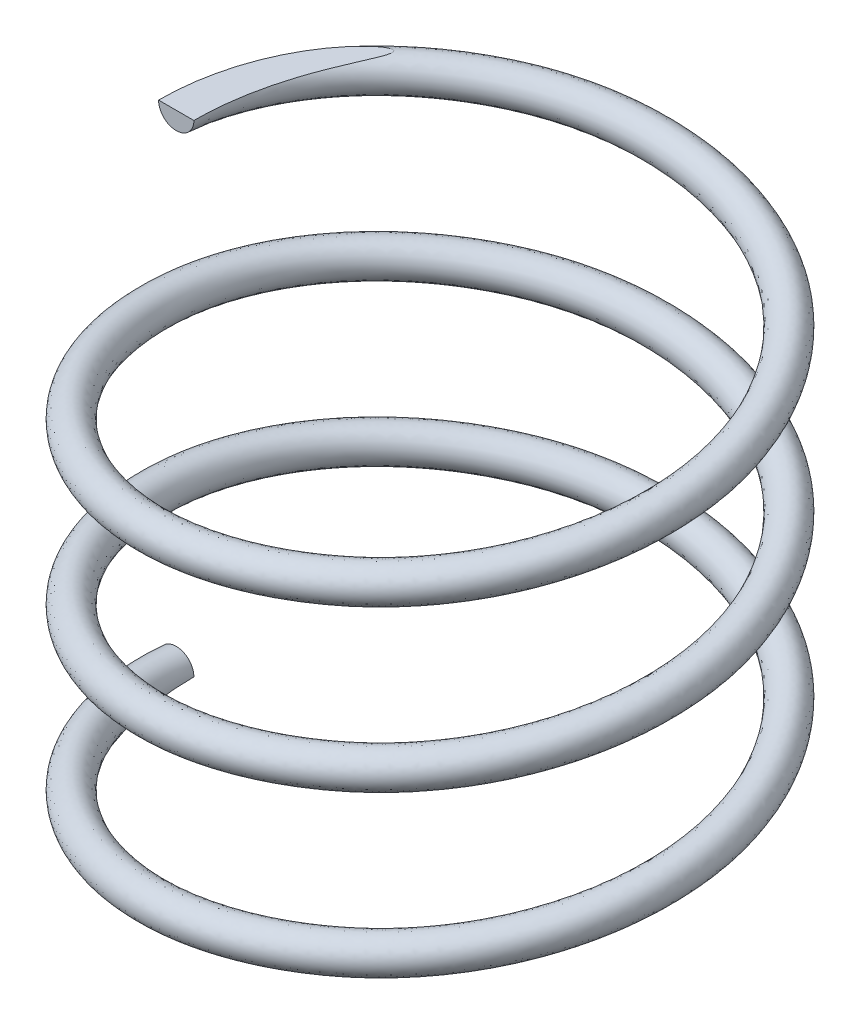
ISO-10303-21;
HEADER;
FILE_DESCRIPTION(('STEP AP214'),'2;1');
FILE_NAME('part.step','',(''),(''),'','','');
FILE_SCHEMA(('AUTOMOTIVE_DESIGN { 1 0 10303 214 1 1 1 1 }'));
ENDSEC;
DATA;
#1=APPLICATION_CONTEXT('core data for automotive mechanical design processes');
#2=APPLICATION_PROTOCOL_DEFINITION('international standard','automotive_design',2000,#1);
#3=PRODUCT_CONTEXT('',#1,'mechanical');
#4=PRODUCT('Part','Part','',(#3));
#5=PRODUCT_RELATED_PRODUCT_CATEGORY('part','',(#4));
#6=PRODUCT_DEFINITION_FORMATION('','',#4);
#7=PRODUCT_DEFINITION_CONTEXT('part definition',#1,'design');
#8=PRODUCT_DEFINITION('design','',#6,#7);
#9=PRODUCT_DEFINITION_SHAPE('','',#8);
#10=(LENGTH_UNIT() NAMED_UNIT(*) SI_UNIT(.MILLI.,.METRE.));
#11=(NAMED_UNIT(*) PLANE_ANGLE_UNIT() SI_UNIT($,.RADIAN.));
#12=(NAMED_UNIT(*) SI_UNIT($,.STERADIAN.) SOLID_ANGLE_UNIT());
#13=UNCERTAINTY_MEASURE_WITH_UNIT(LENGTH_MEASURE(1.E-05),#10,'distance_accuracy_value','');
#14=(GEOMETRIC_REPRESENTATION_CONTEXT(3) GLOBAL_UNCERTAINTY_ASSIGNED_CONTEXT((#13)) GLOBAL_UNIT_ASSIGNED_CONTEXT((#10,
#11,#12)) REPRESENTATION_CONTEXT('',''));
#15=CARTESIAN_POINT('',(0.,0.,0.));
#16=DIRECTION('',(0.,0.,1.));
#17=DIRECTION('',(1.,0.,0.));
#18=AXIS2_PLACEMENT_3D('',#15,#16,#17);
#19=CARTESIAN_POINT('',(-10.033,19.05,4.20360387271358E-13));
#20=DIRECTION('',(0.,0.,1.));
#21=DIRECTION('',(1.,0.,0.));
#22=AXIS2_PLACEMENT_3D('',#19,#20,#21);
#23=PLANE('',#22);
#24=CARTESIAN_POINT('',(-10.033,19.05,4.20360387271358E-13));
#25=DIRECTION('',(0.,0.,1.));
#26=DIRECTION('',(1.,0.,0.));
#27=AXIS2_PLACEMENT_3D('',#24,#25,#26);
#28=CIRCLE('',#27,0.698499999999999);
#29=CARTESIAN_POINT('',(-10.7315,19.05,0.));
#30=VERTEX_POINT('',#29);
#31=CARTESIAN_POINT('',(-9.3345,19.05,3.91094790689175E-13));
#32=VERTEX_POINT('',#31);
#33=EDGE_CURVE('E68',#30,#32,#28,.T.);
#34=ORIENTED_EDGE('',*,*,#33,.T.);
#35=DIRECTION('',(-1.,0.,0.));
#36=VECTOR('',#35,1.);
#37=CARTESIAN_POINT('',(-10.033,19.05,4.20360387271358E-13));
#38=LINE('',#37,#36);
#39=EDGE_CURVE('E54',#32,#30,#38,.T.);
#40=ORIENTED_EDGE('',*,*,#39,.T.);
#41=EDGE_LOOP('',(#34,#40));
#42=FACE_BOUND('',#41,.T.);
#43=ADVANCED_FACE('F34',(#42),#23,.T.);
#44=CARTESIAN_POINT('',(-9.3345,0.,0.));
#45=CARTESIAN_POINT('',(-9.3345,0.529166666666664,5.38927608775056));
#46=CARTESIAN_POINT('',(-4.66725,1.05833333333333,8.08391413162584));
#47=CARTESIAN_POINT('',(0.,1.58749999999999,10.7785521755011));
#48=CARTESIAN_POINT('',(4.66725,2.11666666666666,8.08391413162584));
#49=CARTESIAN_POINT('',(9.3345,2.64583333333333,5.38927608775056));
#50=CARTESIAN_POINT('',(9.3345,3.17499999999999,0.));
#51=CARTESIAN_POINT('',(9.3345,3.70416666666666,-5.38927608775056));
#52=CARTESIAN_POINT('',(4.66725,4.23333333333332,-8.08391413162584));
#53=CARTESIAN_POINT('',(0.,4.76249999999999,-10.7785521755011));
#54=CARTESIAN_POINT('',(-4.66724999999999,5.29166666666665,-8.08391413162584));
#55=CARTESIAN_POINT('',(-9.33449999999999,5.82083333333332,-5.38927608775057));
#56=CARTESIAN_POINT('',(-9.3345,6.34999999999998,0.));
#57=CARTESIAN_POINT('',(-9.3345,6.87916666666665,5.38927608775056));
#58=CARTESIAN_POINT('',(-4.66725,7.40833333333331,8.08391413162584));
#59=CARTESIAN_POINT('',(0.,7.93749999999998,10.7785521755011));
#60=CARTESIAN_POINT('',(4.66725,8.46666666666664,8.08391413162584));
#61=CARTESIAN_POINT('',(9.3345,8.99583333333331,5.38927608775056));
#62=CARTESIAN_POINT('',(9.3345,9.52499999999997,0.));
#63=CARTESIAN_POINT('',(9.3345,10.0541666666666,-5.38927608775056));
#64=CARTESIAN_POINT('',(4.66725,10.5833333333333,-8.08391413162584));
#65=CARTESIAN_POINT('',(0.,11.1125,-10.7785521755011));
#66=CARTESIAN_POINT('',(-4.66724999999999,11.6416666666666,-8.08391413162584));
#67=CARTESIAN_POINT('',(-9.33449999999999,12.1708333333333,-5.38927608775057));
#68=CARTESIAN_POINT('',(-9.3345,12.7,0.));
#69=CARTESIAN_POINT('',(-9.3345,13.2291666666666,5.38927608775056));
#70=CARTESIAN_POINT('',(-4.66725,13.7583333333333,8.08391413162584));
#71=CARTESIAN_POINT('',(0.,14.2875,10.7785521755011));
#72=CARTESIAN_POINT('',(4.66725,14.8166666666666,8.08391413162584));
#73=CARTESIAN_POINT('',(9.3345,15.3458333333333,5.38927608775056));
#74=CARTESIAN_POINT('',(9.3345,15.875,0.));
#75=CARTESIAN_POINT('',(9.3345,16.4041666666666,-5.38927608775056));
#76=CARTESIAN_POINT('',(4.66725,16.9333333333333,-8.08391413162584));
#77=CARTESIAN_POINT('',(0.,17.4625,-10.7785521755011));
#78=CARTESIAN_POINT('',(-4.66724999999999,17.9916666666666,-8.08391413162584));
#79=CARTESIAN_POINT('',(-9.33449999999999,18.5208333333333,-5.38927608775057));
#80=CARTESIAN_POINT('',(-9.3345,19.05,0.));
#81=CARTESIAN_POINT('',(-9.3345,1.397,0.));
#82=CARTESIAN_POINT('',(-9.3345,1.92616666666666,5.38927608775056));
#83=CARTESIAN_POINT('',(-4.66725,2.45533333333333,8.08391413162584));
#84=CARTESIAN_POINT('',(0.,2.98449999999999,10.7785521755011));
#85=CARTESIAN_POINT('',(4.66725,3.51366666666666,8.08391413162584));
#86=CARTESIAN_POINT('',(9.3345,4.04283333333332,5.38927608775056));
#87=CARTESIAN_POINT('',(9.3345,4.57199999999999,0.));
#88=CARTESIAN_POINT('',(9.3345,5.10116666666665,-5.38927608775056));
#89=CARTESIAN_POINT('',(4.66725,5.63033333333332,-8.08391413162584));
#90=CARTESIAN_POINT('',(0.,6.15949999999999,-10.7785521755011));
#91=CARTESIAN_POINT('',(-4.66724999999999,6.68866666666665,-8.08391413162584));
#92=CARTESIAN_POINT('',(-9.3345,7.21783333333332,-5.38927608775057));
#93=CARTESIAN_POINT('',(-9.3345,7.74699999999998,0.));
#94=CARTESIAN_POINT('',(-9.3345,8.27616666666665,5.38927608775056));
#95=CARTESIAN_POINT('',(-4.66725,8.80533333333331,8.08391413162584));
#96=CARTESIAN_POINT('',(0.,9.33449999999998,10.7785521755011));
#97=CARTESIAN_POINT('',(4.66725,9.86366666666664,8.08391413162584));
#98=CARTESIAN_POINT('',(9.3345,10.3928333333333,5.38927608775056));
#99=CARTESIAN_POINT('',(9.3345,10.922,0.));
#100=CARTESIAN_POINT('',(9.3345,11.4511666666666,-5.38927608775056));
#101=CARTESIAN_POINT('',(4.66725,11.9803333333333,-8.08391413162584));
#102=CARTESIAN_POINT('',(0.,12.5095,-10.7785521755011));
#103=CARTESIAN_POINT('',(-4.66724999999999,13.0386666666666,-8.08391413162584));
#104=CARTESIAN_POINT('',(-9.3345,13.5678333333333,-5.38927608775057));
#105=CARTESIAN_POINT('',(-9.3345,14.097,0.));
#106=CARTESIAN_POINT('',(-9.3345,14.6261666666666,5.38927608775056));
#107=CARTESIAN_POINT('',(-4.66725,15.1553333333333,8.08391413162584));
#108=CARTESIAN_POINT('',(0.,15.6845,10.7785521755011));
#109=CARTESIAN_POINT('',(4.66725,16.2136666666666,8.08391413162584));
#110=CARTESIAN_POINT('',(9.3345,16.7428333333333,5.38927608775056));
#111=CARTESIAN_POINT('',(9.3345,17.272,0.));
#112=CARTESIAN_POINT('',(9.3345,17.8011666666666,-5.38927608775056));
#113=CARTESIAN_POINT('',(4.66725,18.3303333333333,-8.08391413162584));
#114=CARTESIAN_POINT('',(0.,18.8595,-10.7785521755011));
#115=CARTESIAN_POINT('',(-4.66724999999999,19.3886666666666,-8.08391413162584));
#116=CARTESIAN_POINT('',(-9.3345,19.9178333333333,-5.38927608775057));
#117=CARTESIAN_POINT('',(-9.3345,20.4469999999999,0.));
#118=CARTESIAN_POINT('',(-10.7315,1.397,0.));
#119=CARTESIAN_POINT('',(-10.7315,1.92616666666666,6.19583441380847));
#120=CARTESIAN_POINT('',(-5.36575,2.45533333333333,9.2937516207127));
#121=CARTESIAN_POINT('',(0.,2.98449999999999,12.3916688276169));
#122=CARTESIAN_POINT('',(5.36575,3.51366666666666,9.2937516207127));
#123=CARTESIAN_POINT('',(10.7315,4.04283333333332,6.19583441380847));
#124=CARTESIAN_POINT('',(10.7315,4.57199999999999,0.));
#125=CARTESIAN_POINT('',(10.7315,5.10116666666665,-6.19583441380846));
#126=CARTESIAN_POINT('',(5.36575,5.63033333333332,-9.2937516207127));
#127=CARTESIAN_POINT('',(0.,6.15949999999999,-12.3916688276169));
#128=CARTESIAN_POINT('',(-5.36574999999999,6.68866666666665,-9.29375162071271));
#129=CARTESIAN_POINT('',(-10.7315,7.21783333333332,-6.19583441380847));
#130=CARTESIAN_POINT('',(-10.7315,7.74699999999998,0.));
#131=CARTESIAN_POINT('',(-10.7315,8.27616666666665,6.19583441380847));
#132=CARTESIAN_POINT('',(-5.36575,8.80533333333331,9.2937516207127));
#133=CARTESIAN_POINT('',(0.,9.33449999999998,12.3916688276169));
#134=CARTESIAN_POINT('',(5.36575,9.86366666666664,9.2937516207127));
#135=CARTESIAN_POINT('',(10.7315,10.3928333333333,6.19583441380847));
#136=CARTESIAN_POINT('',(10.7315,10.922,0.));
#137=CARTESIAN_POINT('',(10.7315,11.4511666666666,-6.19583441380846));
#138=CARTESIAN_POINT('',(5.36575,11.9803333333333,-9.2937516207127));
#139=CARTESIAN_POINT('',(0.,12.5095,-12.3916688276169));
#140=CARTESIAN_POINT('',(-5.36574999999999,13.0386666666666,-9.29375162071271));
#141=CARTESIAN_POINT('',(-10.7315,13.5678333333333,-6.19583441380847));
#142=CARTESIAN_POINT('',(-10.7315,14.097,0.));
#143=CARTESIAN_POINT('',(-10.7315,14.6261666666666,6.19583441380847));
#144=CARTESIAN_POINT('',(-5.36575,15.1553333333333,9.2937516207127));
#145=CARTESIAN_POINT('',(0.,15.6845,12.3916688276169));
#146=CARTESIAN_POINT('',(5.36575,16.2136666666666,9.2937516207127));
#147=CARTESIAN_POINT('',(10.7315,16.7428333333333,6.19583441380847));
#148=CARTESIAN_POINT('',(10.7315,17.272,0.));
#149=CARTESIAN_POINT('',(10.7315,17.8011666666666,-6.19583441380846));
#150=CARTESIAN_POINT('',(5.36575,18.3303333333333,-9.2937516207127));
#151=CARTESIAN_POINT('',(0.,18.8595,-12.3916688276169));
#152=CARTESIAN_POINT('',(-5.36574999999999,19.3886666666666,-9.29375162071271));
#153=CARTESIAN_POINT('',(-10.7315,19.9178333333333,-6.19583441380847));
#154=CARTESIAN_POINT('',(-10.7315,20.4469999999999,0.));
#155=CARTESIAN_POINT('',(-10.7315,0.,0.));
#156=CARTESIAN_POINT('',(-10.7315,0.529166666666664,6.19583441380847));
#157=CARTESIAN_POINT('',(-5.36575,1.05833333333333,9.2937516207127));
#158=CARTESIAN_POINT('',(0.,1.5875,12.3916688276169));
#159=CARTESIAN_POINT('',(5.36575,2.11666666666666,9.2937516207127));
#160=CARTESIAN_POINT('',(10.7315,2.64583333333333,6.19583441380847));
#161=CARTESIAN_POINT('',(10.7315,3.17499999999999,0.));
#162=CARTESIAN_POINT('',(10.7315,3.70416666666666,-6.19583441380846));
#163=CARTESIAN_POINT('',(5.36575,4.23333333333332,-9.2937516207127));
#164=CARTESIAN_POINT('',(0.,4.76249999999999,-12.3916688276169));
#165=CARTESIAN_POINT('',(-5.36574999999999,5.29166666666665,-9.29375162071271));
#166=CARTESIAN_POINT('',(-10.7315,5.82083333333332,-6.19583441380847));
#167=CARTESIAN_POINT('',(-10.7315,6.34999999999998,0.));
#168=CARTESIAN_POINT('',(-10.7315,6.87916666666665,6.19583441380847));
#169=CARTESIAN_POINT('',(-5.36575,7.40833333333331,9.2937516207127));
#170=CARTESIAN_POINT('',(0.,7.93749999999998,12.3916688276169));
#171=CARTESIAN_POINT('',(5.36575,8.46666666666664,9.2937516207127));
#172=CARTESIAN_POINT('',(10.7315,8.99583333333331,6.19583441380847));
#173=CARTESIAN_POINT('',(10.7315,9.52499999999997,0.));
#174=CARTESIAN_POINT('',(10.7315,10.0541666666666,-6.19583441380846));
#175=CARTESIAN_POINT('',(5.36575,10.5833333333333,-9.2937516207127));
#176=CARTESIAN_POINT('',(0.,11.1125,-12.3916688276169));
#177=CARTESIAN_POINT('',(-5.36574999999999,11.6416666666666,-9.29375162071271));
#178=CARTESIAN_POINT('',(-10.7315,12.1708333333333,-6.19583441380847));
#179=CARTESIAN_POINT('',(-10.7315,12.7,0.));
#180=CARTESIAN_POINT('',(-10.7315,13.2291666666666,6.19583441380847));
#181=CARTESIAN_POINT('',(-5.36575,13.7583333333333,9.2937516207127));
#182=CARTESIAN_POINT('',(0.,14.2875,12.3916688276169));
#183=CARTESIAN_POINT('',(5.36575,14.8166666666666,9.2937516207127));
#184=CARTESIAN_POINT('',(10.7315,15.3458333333333,6.19583441380847));
#185=CARTESIAN_POINT('',(10.7315,15.875,0.));
#186=CARTESIAN_POINT('',(10.7315,16.4041666666666,-6.19583441380846));
#187=CARTESIAN_POINT('',(5.36575,16.9333333333333,-9.2937516207127));
#188=CARTESIAN_POINT('',(0.,17.4625,-12.3916688276169));
#189=CARTESIAN_POINT('',(-5.36574999999999,17.9916666666666,-9.29375162071271));
#190=CARTESIAN_POINT('',(-10.7315,18.5208333333333,-6.19583441380847));
#191=CARTESIAN_POINT('',(-10.7315,19.05,0.));
#192=CARTESIAN_POINT('',(-10.7315,-1.397,0.));
#193=CARTESIAN_POINT('',(-10.7315,-0.867833333333334,6.19583441380847));
#194=CARTESIAN_POINT('',(-5.36575,-0.338666666666669,9.2937516207127));
#195=CARTESIAN_POINT('',(0.,0.190499999999997,12.3916688276169));
#196=CARTESIAN_POINT('',(5.36575,0.719666666666662,9.2937516207127));
#197=CARTESIAN_POINT('',(10.7315,1.24883333333333,6.19583441380847));
#198=CARTESIAN_POINT('',(10.7315,1.77799999999999,0.));
#199=CARTESIAN_POINT('',(10.7315,2.30716666666666,-6.19583441380846));
#200=CARTESIAN_POINT('',(5.36575,2.83633333333332,-9.2937516207127));
#201=CARTESIAN_POINT('',(0.,3.36549999999999,-12.3916688276169));
#202=CARTESIAN_POINT('',(-5.36574999999999,3.89466666666665,-9.29375162071271));
#203=CARTESIAN_POINT('',(-10.7315,4.42383333333332,-6.19583441380847));
#204=CARTESIAN_POINT('',(-10.7315,4.95299999999999,0.));
#205=CARTESIAN_POINT('',(-10.7315,5.48216666666665,6.19583441380847));
#206=CARTESIAN_POINT('',(-5.36575,6.01133333333332,9.2937516207127));
#207=CARTESIAN_POINT('',(0.,6.54049999999998,12.3916688276169));
#208=CARTESIAN_POINT('',(5.36575,7.06966666666665,9.2937516207127));
#209=CARTESIAN_POINT('',(10.7315,7.59883333333331,6.19583441380847));
#210=CARTESIAN_POINT('',(10.7315,8.12799999999998,0.));
#211=CARTESIAN_POINT('',(10.7315,8.65716666666664,-6.19583441380846));
#212=CARTESIAN_POINT('',(5.36575,9.18633333333331,-9.2937516207127));
#213=CARTESIAN_POINT('',(0.,9.71549999999997,-12.3916688276169));
#214=CARTESIAN_POINT('',(-5.36574999999999,10.2446666666666,-9.29375162071271));
#215=CARTESIAN_POINT('',(-10.7315,10.7738333333333,-6.19583441380847));
#216=CARTESIAN_POINT('',(-10.7315,11.303,0.));
#217=CARTESIAN_POINT('',(-10.7315,11.8321666666666,6.19583441380847));
#218=CARTESIAN_POINT('',(-5.36575,12.3613333333333,9.2937516207127));
#219=CARTESIAN_POINT('',(0.,12.8905,12.3916688276169));
#220=CARTESIAN_POINT('',(5.36575,13.4196666666666,9.2937516207127));
#221=CARTESIAN_POINT('',(10.7315,13.9488333333333,6.19583441380847));
#222=CARTESIAN_POINT('',(10.7315,14.478,0.));
#223=CARTESIAN_POINT('',(10.7315,15.0071666666666,-6.19583441380846));
#224=CARTESIAN_POINT('',(5.36575,15.5363333333333,-9.2937516207127));
#225=CARTESIAN_POINT('',(0.,16.0655,-12.3916688276169));
#226=CARTESIAN_POINT('',(-5.36574999999999,16.5946666666666,-9.29375162071271));
#227=CARTESIAN_POINT('',(-10.7315,17.1238333333333,-6.19583441380847));
#228=CARTESIAN_POINT('',(-10.7315,17.653,0.));
#229=CARTESIAN_POINT('',(-9.3345,-1.397,0.));
#230=CARTESIAN_POINT('',(-9.3345,-0.867833333333334,5.38927608775056));
#231=CARTESIAN_POINT('',(-4.66725,-0.338666666666669,8.08391413162584));
#232=CARTESIAN_POINT('',(0.,0.190499999999997,10.7785521755011));
#233=CARTESIAN_POINT('',(4.66725,0.719666666666662,8.08391413162584));
#234=CARTESIAN_POINT('',(9.3345,1.24883333333333,5.38927608775056));
#235=CARTESIAN_POINT('',(9.3345,1.77799999999999,0.));
#236=CARTESIAN_POINT('',(9.3345,2.30716666666666,-5.38927608775056));
#237=CARTESIAN_POINT('',(4.66725,2.83633333333332,-8.08391413162584));
#238=CARTESIAN_POINT('',(0.,3.36549999999999,-10.7785521755011));
#239=CARTESIAN_POINT('',(-4.66724999999999,3.89466666666665,-8.08391413162584));
#240=CARTESIAN_POINT('',(-9.3345,4.42383333333332,-5.38927608775057));
#241=CARTESIAN_POINT('',(-9.3345,4.95299999999999,0.));
#242=CARTESIAN_POINT('',(-9.3345,5.48216666666665,5.38927608775056));
#243=CARTESIAN_POINT('',(-4.66725,6.01133333333331,8.08391413162584));
#244=CARTESIAN_POINT('',(0.,6.54049999999998,10.7785521755011));
#245=CARTESIAN_POINT('',(4.66725,7.06966666666665,8.08391413162584));
#246=CARTESIAN_POINT('',(9.3345,7.59883333333331,5.38927608775056));
#247=CARTESIAN_POINT('',(9.3345,8.12799999999998,0.));
#248=CARTESIAN_POINT('',(9.3345,8.65716666666664,-5.38927608775056));
#249=CARTESIAN_POINT('',(4.66725,9.18633333333331,-8.08391413162584));
#250=CARTESIAN_POINT('',(0.,9.71549999999997,-10.7785521755011));
#251=CARTESIAN_POINT('',(-4.66724999999999,10.2446666666666,-8.08391413162584));
#252=CARTESIAN_POINT('',(-9.3345,10.7738333333333,-5.38927608775057));
#253=CARTESIAN_POINT('',(-9.3345,11.303,0.));
#254=CARTESIAN_POINT('',(-9.3345,11.8321666666666,5.38927608775056));
#255=CARTESIAN_POINT('',(-4.66725,12.3613333333333,8.08391413162584));
#256=CARTESIAN_POINT('',(0.,12.8905,10.7785521755011));
#257=CARTESIAN_POINT('',(4.66725,13.4196666666666,8.08391413162584));
#258=CARTESIAN_POINT('',(9.3345,13.9488333333333,5.38927608775056));
#259=CARTESIAN_POINT('',(9.3345,14.478,0.));
#260=CARTESIAN_POINT('',(9.3345,15.0071666666666,-5.38927608775056));
#261=CARTESIAN_POINT('',(4.66725,15.5363333333333,-8.08391413162584));
#262=CARTESIAN_POINT('',(0.,16.0655,-10.7785521755011));
#263=CARTESIAN_POINT('',(-4.66724999999999,16.5946666666666,-8.08391413162584));
#264=CARTESIAN_POINT('',(-9.3345,17.1238333333333,-5.38927608775057));
#265=CARTESIAN_POINT('',(-9.3345,17.653,0.));
#266=CARTESIAN_POINT('',(-9.3345,0.,0.));
#267=CARTESIAN_POINT('',(-9.3345,0.529166666666664,5.38927608775056));
#268=CARTESIAN_POINT('',(-4.66725,1.05833333333333,8.08391413162584));
#269=CARTESIAN_POINT('',(0.,1.58749999999999,10.7785521755011));
#270=CARTESIAN_POINT('',(4.66725,2.11666666666666,8.08391413162584));
#271=CARTESIAN_POINT('',(9.3345,2.64583333333333,5.38927608775056));
#272=CARTESIAN_POINT('',(9.3345,3.17499999999999,0.));
#273=CARTESIAN_POINT('',(9.3345,3.70416666666666,-5.38927608775056));
#274=CARTESIAN_POINT('',(4.66725,4.23333333333332,-8.08391413162584));
#275=CARTESIAN_POINT('',(0.,4.76249999999999,-10.7785521755011));
#276=CARTESIAN_POINT('',(-4.66724999999999,5.29166666666665,-8.08391413162584));
#277=CARTESIAN_POINT('',(-9.33449999999999,5.82083333333332,-5.38927608775057));
#278=CARTESIAN_POINT('',(-9.3345,6.34999999999998,0.));
#279=CARTESIAN_POINT('',(-9.3345,6.87916666666665,5.38927608775056));
#280=CARTESIAN_POINT('',(-4.66725,7.40833333333331,8.08391413162584));
#281=CARTESIAN_POINT('',(0.,7.93749999999998,10.7785521755011));
#282=CARTESIAN_POINT('',(4.66725,8.46666666666664,8.08391413162584));
#283=CARTESIAN_POINT('',(9.3345,8.99583333333331,5.38927608775056));
#284=CARTESIAN_POINT('',(9.3345,9.52499999999997,0.));
#285=CARTESIAN_POINT('',(9.3345,10.0541666666666,-5.38927608775056));
#286=CARTESIAN_POINT('',(4.66725,10.5833333333333,-8.08391413162584));
#287=CARTESIAN_POINT('',(0.,11.1125,-10.7785521755011));
#288=CARTESIAN_POINT('',(-4.66724999999999,11.6416666666666,-8.08391413162584));
#289=CARTESIAN_POINT('',(-9.33449999999999,12.1708333333333,-5.38927608775057));
#290=CARTESIAN_POINT('',(-9.3345,12.7,0.));
#291=CARTESIAN_POINT('',(-9.3345,13.2291666666666,5.38927608775056));
#292=CARTESIAN_POINT('',(-4.66725,13.7583333333333,8.08391413162584));
#293=CARTESIAN_POINT('',(0.,14.2875,10.7785521755011));
#294=CARTESIAN_POINT('',(4.66725,14.8166666666666,8.08391413162584));
#295=CARTESIAN_POINT('',(9.3345,15.3458333333333,5.38927608775056));
#296=CARTESIAN_POINT('',(9.3345,15.875,0.));
#297=CARTESIAN_POINT('',(9.3345,16.4041666666666,-5.38927608775056));
#298=CARTESIAN_POINT('',(4.66725,16.9333333333333,-8.08391413162584));
#299=CARTESIAN_POINT('',(0.,17.4625,-10.7785521755011));
#300=CARTESIAN_POINT('',(-4.66724999999999,17.9916666666666,-8.08391413162584));
#301=CARTESIAN_POINT('',(-9.33449999999999,18.5208333333333,-5.38927608775057));
#302=CARTESIAN_POINT('',(-9.3345,19.05,0.));
#303=(BOUNDED_SURFACE() B_SPLINE_SURFACE(3,2,((#44,#45,#46,#47,#48,#49,#50,#51,#52,#53,#54,#55,
#56,#57,#58,#59,#60,#61,#62,#63,#64,#65,#66,#67,#68,#69,#70,#71,#72,#73,#74,#75,#76,#77,#78,#79,
#80),(#81,#82,#83,#84,#85,#86,#87,#88,#89,#90,#91,#92,#93,#94,#95,#96,#97,#98,#99,#100,#101,
#102,#103,#104,#105,#106,#107,#108,#109,#110,#111,#112,#113,#114,#115,#116,#117),(#118,#119,
#120,#121,#122,#123,#124,#125,#126,#127,#128,#129,#130,#131,#132,#133,#134,#135,#136,#137,#138,
#139,#140,#141,#142,#143,#144,#145,#146,#147,#148,#149,#150,#151,#152,#153,#154),(#155,#156,
#157,#158,#159,#160,#161,#162,#163,#164,#165,#166,#167,#168,#169,#170,#171,#172,#173,#174,#175,
#176,#177,#178,#179,#180,#181,#182,#183,#184,#185,#186,#187,#188,#189,#190,#191),(#192,#193,
#194,#195,#196,#197,#198,#199,#200,#201,#202,#203,#204,#205,#206,#207,#208,#209,#210,#211,#212,
#213,#214,#215,#216,#217,#218,#219,#220,#221,#222,#223,#224,#225,#226,#227,#228),(#229,#230,
#231,#232,#233,#234,#235,#236,#237,#238,#239,#240,#241,#242,#243,#244,#245,#246,#247,#248,#249,
#250,#251,#252,#253,#254,#255,#256,#257,#258,#259,#260,#261,#262,#263,#264,#265),(#266,#267,
#268,#269,#270,#271,#272,#273,#274,#275,#276,#277,#278,#279,#280,#281,#282,#283,#284,#285,#286,
#287,#288,#289,#290,#291,#292,#293,#294,#295,#296,#297,#298,#299,#300,#301,#302)),.UNSPECIFIED.,
.T.,.F.,.F.) B_SPLINE_SURFACE_WITH_KNOTS((4,3,4),(3,2,2,2,2,2,2,2,2,2,2,2,2,2,2,2,2,2,3),(0.,
0.5,1.),(0.,0.0555555555555556,0.111111111111111,0.166666666666667,0.222222222222222,
0.277777777777778,0.333333333333333,0.388888888888889,0.444444444444444,0.5,0.555555555555556,
0.611111111111111,0.666666666666667,0.722222222222222,0.777777777777778,0.833333333333333,
0.888888888888889,0.944444444444444,1.),
.UNSPECIFIED.) GEOMETRIC_REPRESENTATION_ITEM() RATIONAL_B_SPLINE_SURFACE(((1.,0.866025403784439,
1.,0.866025403784439,1.,0.866025403784439,1.,0.866025403784439,1.,0.866025403784439,1.,
0.866025403784439,1.,0.866025403784439,1.,0.866025403784439,1.,0.866025403784439,1.,
0.866025403784439,1.,0.866025403784439,1.,0.866025403784439,1.,0.866025403784439,1.,
0.866025403784439,1.,0.866025403784439,1.,0.866025403784439,1.,0.866025403784439,1.,
0.866025403784439,1.),(0.333333333333333,0.288675134594813,0.333333333333333,0.288675134594813,
0.333333333333333,0.288675134594813,0.333333333333333,0.288675134594813,0.333333333333333,
0.288675134594813,0.333333333333333,0.288675134594813,0.333333333333333,0.288675134594813,
0.333333333333333,0.288675134594813,0.333333333333333,0.288675134594813,0.333333333333333,
0.288675134594813,0.333333333333333,0.288675134594813,0.333333333333333,0.288675134594813,
0.333333333333333,0.288675134594813,0.333333333333333,0.288675134594813,0.333333333333333,
0.288675134594813,0.333333333333333,0.288675134594813,0.333333333333333,0.288675134594813,
0.333333333333333,0.288675134594813,0.333333333333333),(0.333333333333333,0.288675134594813,
0.333333333333333,0.288675134594813,0.333333333333333,0.288675134594813,0.333333333333333,
0.288675134594813,0.333333333333333,0.288675134594813,0.333333333333333,0.288675134594813,
0.333333333333333,0.288675134594813,0.333333333333333,0.288675134594813,0.333333333333333,
0.288675134594813,0.333333333333333,0.288675134594813,0.333333333333333,0.288675134594813,
0.333333333333333,0.288675134594813,0.333333333333333,0.288675134594813,0.333333333333333,
0.288675134594813,0.333333333333333,0.288675134594813,0.333333333333333,0.288675134594813,
0.333333333333333,0.288675134594813,0.333333333333333,0.288675134594813,0.333333333333333),(1.,
0.866025403784439,1.,0.866025403784439,1.,0.866025403784439,1.,0.866025403784439,1.,
0.866025403784439,1.,0.866025403784439,1.,0.866025403784439,1.,0.866025403784439,1.,
0.866025403784439,1.,0.866025403784439,1.,0.866025403784439,1.,0.866025403784439,1.,
0.866025403784439,1.,0.866025403784439,1.,0.866025403784439,1.,0.866025403784439,1.,
0.866025403784439,1.,0.866025403784439,1.),(0.333333333333333,0.288675134594813,
0.333333333333333,0.288675134594813,0.333333333333333,0.288675134594813,0.333333333333333,
0.288675134594813,0.333333333333333,0.288675134594813,0.333333333333333,0.288675134594813,
0.333333333333333,0.288675134594813,0.333333333333333,0.288675134594813,0.333333333333333,
0.288675134594813,0.333333333333333,0.288675134594813,0.333333333333333,0.288675134594813,
0.333333333333333,0.288675134594813,0.333333333333333,0.288675134594813,0.333333333333333,
0.288675134594813,0.333333333333333,0.288675134594813,0.333333333333333,0.288675134594813,
0.333333333333333,0.288675134594813,0.333333333333333,0.288675134594813,0.333333333333333),
(0.333333333333333,0.288675134594813,0.333333333333333,0.288675134594813,0.333333333333333,
0.288675134594813,0.333333333333333,0.288675134594813,0.333333333333333,0.288675134594813,
0.333333333333333,0.288675134594813,0.333333333333333,0.288675134594813,0.333333333333333,
0.288675134594813,0.333333333333333,0.288675134594813,0.333333333333333,0.288675134594813,
0.333333333333333,0.288675134594813,0.333333333333333,0.288675134594813,0.333333333333333,
0.288675134594813,0.333333333333333,0.288675134594813,0.333333333333333,0.288675134594813,
0.333333333333333,0.288675134594813,0.333333333333333,0.288675134594813,0.333333333333333,
0.288675134594813,0.333333333333333),(1.,0.866025403784439,1.,0.866025403784439,1.,
0.866025403784439,1.,0.866025403784439,1.,0.866025403784439,1.,0.866025403784439,1.,
0.866025403784439,1.,0.866025403784439,1.,0.866025403784439,1.,0.866025403784439,1.,
0.866025403784439,1.,0.866025403784439,1.,0.866025403784439,1.,0.866025403784439,1.,
0.866025403784439,1.,0.866025403784439,1.,0.866025403784439,1.,0.866025403784439,1.))) REPRESENTATION_ITEM('') SURFACE());
#304=CARTESIAN_POINT('',(-9.3345,0.,0.));
#305=CARTESIAN_POINT('',(-9.3345010567637,0.,0.11553168569988));
#306=CARTESIAN_POINT('',(-9.33263151036953,0.,0.231061522384767));
#307=CARTESIAN_POINT('',(-9.32519596450068,0.,0.461958595779101));
#308=CARTESIAN_POINT('',(-9.31963136506569,0.,0.577325877495073));
#309=CARTESIAN_POINT('',(-9.30487048274304,0.,0.807513448769842));
#310=CARTESIAN_POINT('',(-9.29568410911942,0.,0.922334372835104));
#311=CARTESIAN_POINT('',(-9.27372869580333,0.,1.15166806397002));
#312=CARTESIAN_POINT('',(-9.26095844493121,0.,1.26618071362607));
#313=CARTESIAN_POINT('',(-9.21741039214753,0.,1.60864257420468));
#314=CARTESIAN_POINT('',(-9.18136748088697,0.,1.83594353642827));
#315=CARTESIAN_POINT('',(-9.09577587811419,0.,2.2880905237513));
#316=CARTESIAN_POINT('',(-9.04621975604469,0.,2.51293512720874));
#317=CARTESIAN_POINT('',(-8.93439145508415,0.,2.95932840322607));
#318=CARTESIAN_POINT('',(-8.87212460823896,0.,3.18087841616657));
#319=CARTESIAN_POINT('',(-8.73551083432194,0.,3.62153325004797));
#320=CARTESIAN_POINT('',(-8.6610998480101,0.,3.84061813328068));
#321=CARTESIAN_POINT('',(-8.54184074127486,0.,4.16640646588163));
#322=CARTESIAN_POINT('',(-8.50081304751854,0.,4.2745315216444));
#323=CARTESIAN_POINT('',(-8.41652212432601,0.,4.48990722441556));
#324=CARTESIAN_POINT('',(-8.37325889955273,0.,4.59715787324728));
#325=CARTESIAN_POINT('',(-8.28494555971164,0.,4.81089007435799));
#326=CARTESIAN_POINT('',(-8.23989582330176,0.,4.91737178402033));
#327=CARTESIAN_POINT('',(-8.14867307519957,0.,5.12985137421673));
#328=CARTESIAN_POINT('',(-8.10250004665844,0.,5.23584924746513));
#329=CARTESIAN_POINT('',(-8.03858837964419,0.,5.38291175112124));
#330=CARTESIAN_POINT('',(-8.02077272061031,0.,5.42394312619984));
#331=CARTESIAN_POINT('',(-7.98530133603457,0.,5.50608980139636));
#332=CARTESIAN_POINT('',(-7.96764566039887,0.,5.54720512311095));
#333=CARTESIAN_POINT('',(-7.93266207591245,0.,5.62962807008057));
#334=CARTESIAN_POINT('',(-7.91533453826677,0.,5.67093585410751));
#335=CARTESIAN_POINT('',(-7.88142633839736,0.,5.75355366909144));
#336=CARTESIAN_POINT('',(-7.86484166058359,0.,5.79486204835918));
#337=CARTESIAN_POINT('',(-7.83278166963281,0.,5.87787918826742));
#338=CARTESIAN_POINT('',(-7.8173054506807,0.,5.91958758966476));
#339=CARTESIAN_POINT('',(-7.79565794499281,0.,5.98265847384373));
#340=CARTESIAN_POINT('',(-7.78870758674366,0.,6.00375179861281));
#341=CARTESIAN_POINT('',(-7.77555890267922,0.,6.04616976408499));
#342=CARTESIAN_POINT('',(-7.76936034569222,0.,6.06749433147479));
#343=CARTESIAN_POINT('',(-7.76021127894678,0.,6.10240464286467));
#344=CARTESIAN_POINT('',(-7.75691359397479,0.,6.11589857198426));
#345=CARTESIAN_POINT('',(-7.75092325800096,0.,6.14304777302007));
#346=CARTESIAN_POINT('',(-7.74823167147175,0.,6.15670328513932));
#347=CARTESIAN_POINT('',(-7.74360638419334,0.,6.18483016267845));
#348=CARTESIAN_POINT('',(-7.74171579436106,0.,6.19930896472951));
#349=CARTESIAN_POINT('',(-7.73941934634681,0.,6.22837163753584));
#350=CARTESIAN_POINT('',(-7.73900964600101,0.,6.24295513789081));
#351=CARTESIAN_POINT('',(-7.74061780307133,0.,6.27047576491597));
#352=CARTESIAN_POINT('',(-7.74237828793342,0.,6.28342061402655));
#353=CARTESIAN_POINT('',(-7.74899675351701,0.,6.30658420095568));
#354=CARTESIAN_POINT('',(-7.75334380733817,0.,6.31691841822374));
#355=CARTESIAN_POINT('',(-7.76437151776833,0.,6.33299312417175));
#356=CARTESIAN_POINT('',(-7.77026057597009,-1.24142105085365E-13,6.33924223807837));
#357=CARTESIAN_POINT('',(-7.7838459064141,1.24027390821462E-13,6.34927258307562));
#358=CARTESIAN_POINT('',(-7.79154302910627,4.59496057810529E-13,6.3530526496402));
#359=CARTESIAN_POINT('',(-7.81094429932944,6.13171541696433E-13,6.35935597679697));
#360=CARTESIAN_POINT('',(-7.82298685038121,1.59315024990941E-13,6.3607087193256));
#361=CARTESIAN_POINT('',(-7.84603095138868,-1.4802365177938E-13,6.36065718657363));
#362=CARTESIAN_POINT('',(-7.85704483729398,0.,6.35944509391194));
#363=CARTESIAN_POINT('',(-7.87883962911983,0.,6.35557336037424));
#364=CARTESIAN_POINT('',(-7.88961966577105,0.,6.35290904786799));
#365=CARTESIAN_POINT('',(-7.91772238856873,0.,6.34461641211387));
#366=CARTESIAN_POINT('',(-7.9347970410328,0.,6.33818365874861));
#367=CARTESIAN_POINT('',(-7.968323344482,0.,6.32383604490466));
#368=CARTESIAN_POINT('',(-7.98477352360723,2.58980453197423E-13,6.31591791618964));
#369=CARTESIAN_POINT('',(-8.01723223922562,-2.60291883755089E-13,6.29904077425012));
#370=CARTESIAN_POINT('',(-8.03323811749965,-9.69534266739592E-13,6.29007669321204));
#371=CARTESIAN_POINT('',(-8.06479388062356,9.68413949949081E-13,6.27142774054796));
#372=CARTESIAN_POINT('',(-8.08034427101174,3.61172706926228E-12,6.2617437137794));
#373=CARTESIAN_POINT('',(-8.12674857441994,6.58274476674309E-12,6.23166056645117));
#374=CARTESIAN_POINT('',(-8.15704436080449,1.80354770871189E-12,6.21040130717173));
#375=CARTESIAN_POINT('',(-8.21650807294737,-1.80462101755871E-12,6.16635202561535));
#376=CARTESIAN_POINT('',(-8.24567531677541,-6.30049956005875E-13,6.14356109989549));
#377=CARTESIAN_POINT('',(-8.33189689657658,1.2625134388046E-12,6.07339064328319));
#378=CARTESIAN_POINT('',(-8.38755401829234,3.38590896284588E-13,6.02429418601926));
#379=CARTESIAN_POINT('',(-8.49600765379767,-3.38725322565348E-13,5.92304784815272));
#380=CARTESIAN_POINT('',(-8.54880302310496,0.,5.8708967630284));
#381=CARTESIAN_POINT('',(-8.65186698047794,0.,5.76427736011999));
#382=CARTESIAN_POINT('',(-8.70213838748588,0.,5.70981175886888));
#383=CARTESIAN_POINT('',(-8.81757127347626,0.,5.57963193126409));
#384=CARTESIAN_POINT('',(-8.88182922813625,0.,5.5031168656866));
#385=CARTESIAN_POINT('',(-9.00666788161618,0.,5.34713294004777));
#386=CARTESIAN_POINT('',(-9.06724765830107,0.,5.26766334725931));
#387=CARTESIAN_POINT('',(-9.24390475253652,0.,5.02525858380487));
#388=CARTESIAN_POINT('',(-9.35475998198445,0.,4.85848822231782));
#389=CARTESIAN_POINT('',(-9.56335600002424,0.,4.51679014267771));
#390=CARTESIAN_POINT('',(-9.66108389524213,0.,4.34185462880817));
#391=CARTESIAN_POINT('',(-9.84356426947736,0.,3.98546774855109));
#392=CARTESIAN_POINT('',(-9.92832292120495,0.,3.80401953297089));
#393=CARTESIAN_POINT('',(-10.1088522515034,0.,3.37975209663727));
#394=CARTESIAN_POINT('',(-10.2001557625377,0.,3.13502280061209));
#395=CARTESIAN_POINT('',(-10.3611593034584,0.,2.63845346838434));
#396=CARTESIAN_POINT('',(-10.4308478585127,0.,2.38660973244238));
#397=CARTESIAN_POINT('',(-10.5485239411809,0.,1.878343556043));
#398=CARTESIAN_POINT('',(-10.5965457486688,0.,1.62192902024631));
#399=CARTESIAN_POINT('',(-10.6711097966269,0.,1.10613773310872));
#400=CARTESIAN_POINT('',(-10.6976659727103,0.,0.846763014648116));
#401=CARTESIAN_POINT('',(-10.7195688512301,0.,0.489053855090916));
#402=CARTESIAN_POINT('',(-10.7240500841687,0.,0.391211381058479));
#403=CARTESIAN_POINT('',(-10.730013097511,0.,0.195582630143507));
#404=CARTESIAN_POINT('',(-10.7314993895739,0.,0.0977964909097659));
#405=CARTESIAN_POINT('',(-10.7315,-2.54263338028209E-13,0.));
#406=B_SPLINE_CURVE_WITH_KNOTS('',3,(#304,#305,#306,#307,#308,#309,#310,#311,#312,#313,#314,
#315,#316,#317,#318,#319,#320,#321,#322,#323,#324,#325,#326,#327,#328,#329,#330,#331,#332,#333,
#334,#335,#336,#337,#338,#339,#340,#341,#342,#343,#344,#345,#346,#347,#348,#349,#350,#351,#352,
#353,#354,#355,#356,#357,#358,#359,#360,#361,#362,#363,#364,#365,#366,#367,#368,#369,#370,#371,
#372,#373,#374,#375,#376,#377,#378,#379,#380,#381,#382,#383,#384,#385,#386,#387,#388,#389,#390,
#391,#392,#393,#394,#395,#396,#397,#398,#399,#400,#401,#402,#403,#404,#405),.UNSPECIFIED.,.F.,
.F.,(4,2,2,2,2,2,2,2,2,2,2,2,2,2,2,2,2,2,2,2,2,2,2,2,2,2,2,2,2,2,2,2,2,2,2,2,2,2,2,2,2,2,2,2,2,
2,2,2,2,2,4),(0.,0.346576957282281,0.693022672919157,1.0385270102366,1.3841482524499,
2.07410673003357,2.7644453652604,3.45449500195643,4.14830978418439,4.49523089740678,
4.84215128704004,5.1889985345195,5.53585098774778,5.6700475871235,5.80428469923217,
5.9386655480842,6.0722003047859,6.20562466363491,6.27224317944543,6.33884115848325,
6.38050443781259,6.42224032812226,6.46600131720816,6.50964868669792,6.54858260565633,
6.58160464323325,6.60684286011343,6.63209297201821,6.66780993280936,6.70094565321307,
6.73418860211701,6.78879750832925,6.84352800930961,6.89853565572909,6.9534797396815,
7.06443026987881,7.17544682781968,7.39790521384784,7.6204519195969,7.84274427242798,
8.14236339524898,8.44205732632245,9.04208225153019,9.64269226461206,10.2430155222385,
11.0255666899428,11.8085325859585,12.5902553370217,13.3714701805878,13.6652703195749,
13.9586275382769),.UNSPECIFIED.);
#407=CARTESIAN_POINT('',(-9.3345,0.,0.));
#408=VERTEX_POINT('',#407);
#409=CARTESIAN_POINT('',(-10.7315,0.,0.));
#410=VERTEX_POINT('',#409);
#411=EDGE_CURVE('E48',#408,#410,#406,.T.);
#412=CARTESIAN_POINT('',(-10.033,0.,0.));
#413=DIRECTION('',(0.,0.,1.));
#414=DIRECTION('',(1.,0.,0.));
#415=AXIS2_PLACEMENT_3D('',#412,#413,#414);
#416=CIRCLE('',#415,0.698499999999999);
#417=EDGE_CURVE('E66',#408,#410,#416,.T.);
#418=CARTESIAN_POINT('',(-10.7315,19.05,0.));
#419=CARTESIAN_POINT('',(-10.7315095952871,19.05,-0.230470336102718));
#420=CARTESIAN_POINT('',(-10.7232431225269,19.05,-0.46095563826891));
#421=CARTESIAN_POINT('',(-10.6899854924267,19.05,-0.921532648039276));
#422=CARTESIAN_POINT('',(-10.6649353675557,19.05,-1.15162009027065));
#423=CARTESIAN_POINT('',(-10.5975564070501,19.05,-1.61192551280076));
#424=CARTESIAN_POINT('',(-10.555035000888,19.05,-1.84211543042928));
#425=CARTESIAN_POINT('',(-10.4526526609024,19.05,-2.29859775012673));
#426=CARTESIAN_POINT('',(-10.3927928214979,19.05,-2.5248903972404));
#427=CARTESIAN_POINT('',(-10.255793634418,19.05,-2.97182943912285));
#428=CARTESIAN_POINT('',(-10.1786803762463,19.05,-3.19248380422711));
#429=CARTESIAN_POINT('',(-10.007040329854,19.05,-3.62701612331176));
#430=CARTESIAN_POINT('',(-9.91250646748873,19.05,-3.84089128289739));
#431=CARTESIAN_POINT('',(-9.69898815262949,19.05,-4.27404355540001));
#432=CARTESIAN_POINT('',(-9.57879484447606,19.05,-4.49273225525396));
#433=CARTESIAN_POINT('',(-9.38322268308997,19.05,-4.81116919079044));
#434=CARTESIAN_POINT('',(-9.31551002500047,19.05,-4.91568226823056));
#435=CARTESIAN_POINT('',(-9.17480815196885,19.05,-5.12108328445689));
#436=CARTESIAN_POINT('',(-9.1018203816697,19.05,-5.22197220450992));
#437=CARTESIAN_POINT('',(-8.98026977635901,19.05,-5.38039346217612));
#438=CARTESIAN_POINT('',(-8.93347018930157,19.05,-5.43928509605283));
#439=CARTESIAN_POINT('',(-8.83772602181974,19.05,-5.55530886311547));
#440=CARTESIAN_POINT('',(-8.7887813733829,19.05,-5.61244094041403));
#441=CARTESIAN_POINT('',(-8.68877186363665,19.05,-5.72444806116982));
#442=CARTESIAN_POINT('',(-8.6377153696691,19.0500000000001,-5.77933056419718));
#443=CARTESIAN_POINT('',(-8.53307724654592,19.0499999999999,-5.88661216287114));
#444=CARTESIAN_POINT('',(-8.47949671533547,19.0499999999998,-5.9390123187923));
#445=CARTESIAN_POINT('',(-8.39693255440863,19.05,-6.01510769445041));
#446=CARTESIAN_POINT('',(-8.36907712724974,19.0500000000001,-6.04002956396392));
#447=CARTESIAN_POINT('',(-8.31249723059895,19.0499999999999,-6.08890526831894));
#448=CARTESIAN_POINT('',(-8.28377228563955,19.0499999999996,-6.11285855617012));
#449=CARTESIAN_POINT('',(-8.22505676841286,19.0500000000004,-6.15973350107411));
#450=CARTESIAN_POINT('',(-8.19505700796323,19.0500000000014,-6.18264368818861));
#451=CARTESIAN_POINT('',(-8.13384589315901,19.0499999999986,-6.22671681088662));
#452=CARTESIAN_POINT('',(-8.10263651319196,19.0499999999947,-6.24788243092387));
#453=CARTESIAN_POINT('',(-8.05437041443666,19.049999999997,-6.27773237708394));
#454=CARTESIAN_POINT('',(-8.03793663228601,19.0499999999992,-6.28741822953149));
#455=CARTESIAN_POINT('',(-8.00449166651402,19.0500000000008,-6.30587096812841));
#456=CARTESIAN_POINT('',(-7.98747887514322,19.0500000000002,-6.31463496224981));
#457=CARTESIAN_POINT('',(-7.95296475313533,19.0499999999998,-6.33070402443835));
#458=CARTESIAN_POINT('',(-7.93547038556526,19.05,-6.33802338122111));
#459=CARTESIAN_POINT('',(-7.90867369577951,19.05,-6.34728360038344));
#460=CARTESIAN_POINT('',(-7.89967071951639,19.05,-6.35007930727632));
#461=CARTESIAN_POINT('',(-7.88146181062426,19.05,-6.35488431646295));
#462=CARTESIAN_POINT('',(-7.87225615522518,19.05,-6.35689463006257));
#463=CARTESIAN_POINT('',(-7.85348673211466,19.05,-6.35980994263916));
#464=CARTESIAN_POINT('',(-7.84391950798236,19.05,-6.36069467820079));
#465=CARTESIAN_POINT('',(-7.82483716870745,19.05,-6.36066991654027));
#466=CARTESIAN_POINT('',(-7.81532256219639,19.05,-6.35977917302233));
#467=CARTESIAN_POINT('',(-7.79746753086766,19.0499999999999,-6.35538080495181));
#468=CARTESIAN_POINT('',(-7.78909113454711,19.0499999999999,-6.35205216935617));
#469=CARTESIAN_POINT('',(-7.77780393365203,19.05,-6.34497470589757));
#470=CARTESIAN_POINT('',(-7.77424165134919,19.0500000000001,-6.34225152492211));
#471=CARTESIAN_POINT('',(-7.76767231747883,19.0499999999999,-6.33620190431731));
#472=CARTESIAN_POINT('',(-7.7646654632934,19.0499999999995,-6.33287525106165));
#473=CARTESIAN_POINT('',(-7.75572714273861,19.0499999999991,-6.32110231145674));
#474=CARTESIAN_POINT('',(-7.75111900886465,19.0499999999998,-6.3116541924396));
#475=CARTESIAN_POINT('',(-7.7450056472946,19.0500000000002,-6.29364264895905));
#476=CARTESIAN_POINT('',(-7.74312009514535,19.05,-6.28518196545969));
#477=CARTESIAN_POINT('',(-7.74053302187899,19.0499999999999,-6.26806417513372));
#478=CARTESIAN_POINT('',(-7.73983490586884,19.05,-6.25940657532581));
#479=CARTESIAN_POINT('',(-7.73911383868969,19.05,-6.23723374060513));
#480=CARTESIAN_POINT('',(-7.7396860111512,19.05,-6.2237069613072));
#481=CARTESIAN_POINT('',(-7.7420471848595,19.05,-6.19678755676299));
#482=CARTESIAN_POINT('',(-7.74383580775888,19.0499999999999,-6.18339489111776));
#483=CARTESIAN_POINT('',(-7.74824610493629,19.0500000000001,-6.15665686955135));
#484=CARTESIAN_POINT('',(-7.75087341216039,19.0500000000003,-6.1433124691102));
#485=CARTESIAN_POINT('',(-7.75671500523039,19.0499999999997,-6.11676176084677));
#486=CARTESIAN_POINT('',(-7.7599290619891,19.0499999999988,-6.10355540124878));
#487=CARTESIAN_POINT('',(-7.77124160197134,19.0499999999975,-6.0601565995732));
#488=CARTESIAN_POINT('',(-7.78025718274069,19.0499999999993,-6.03020549984765));
#489=CARTESIAN_POINT('',(-7.79955238576377,19.0500000000007,-5.9707096193493));
#490=CARTESIAN_POINT('',(-7.80983282335333,19.0500000000002,-5.9411651144558));
#491=CARTESIAN_POINT('',(-7.83121092069728,19.0499999999998,-5.88232281636534));
#492=CARTESIAN_POINT('',(-7.84230981493458,19.0499999999999,-5.85302547331912));
#493=CARTESIAN_POINT('',(-7.86503531091415,19.05,-5.79463538640095));
#494=CARTESIAN_POINT('',(-7.87666195739171,19.05,-5.76554266011578));
#495=CARTESIAN_POINT('',(-7.91202209051758,19.05,-5.67857340879609));
#496=CARTESIAN_POINT('',(-7.93627279939544,19.05,-5.62090812144114));
#497=CARTESIAN_POINT('',(-7.98532260420558,19.05,-5.50588571490668));
#498=CARTESIAN_POINT('',(-8.01012110727343,19.05,-5.44852833876462));
#499=CARTESIAN_POINT('',(-8.0598336443524,19.05,-5.33396852927242));
#500=CARTESIAN_POINT('',(-8.08474744113049,19.05,-5.27676599339646));
#501=CARTESIAN_POINT('',(-8.13446228267238,19.05,-5.16231203578101));
#502=CARTESIAN_POINT('',(-8.15926332731874,19.05,-5.10506061399067));
#503=CARTESIAN_POINT('',(-8.23321679556631,19.05,-4.9331130049538));
#504=CARTESIAN_POINT('',(-8.28192019673963,19.05,-4.81822202048367));
#505=CARTESIAN_POINT('',(-8.377228680778,19.05,-4.58754010969529));
#506=CARTESIAN_POINT('',(-8.4238333418417,19.05,-4.47174900790787));
#507=CARTESIAN_POINT('',(-8.51440584021774,19.05,-4.23913911512524));
#508=CARTESIAN_POINT('',(-8.55837364667112,19.05,-4.12232031212123));
#509=CARTESIAN_POINT('',(-8.68557080327905,19.05,-3.77069812431727));
#510=CARTESIAN_POINT('',(-8.76430000646129,19.05,-3.53423943822041));
#511=CARTESIAN_POINT('',(-8.90780609062437,19.05,-3.05706079998154));
#512=CARTESIAN_POINT('',(-8.97258133847519,19.0500000000001,-2.81634035261948));
#513=CARTESIAN_POINT('',(-9.06277704559244,19.0500000000001,-2.43387542666254));
#514=CARTESIAN_POINT('',(-9.0932583027344,19.05,-2.29330958867578));
#515=CARTESIAN_POINT('',(-9.14898749168196,19.05,-2.0111560382628));
#516=CARTESIAN_POINT('',(-9.17423606022695,19.05,-1.86956845234025));
#517=CARTESIAN_POINT('',(-9.2193467908127,19.05,-1.58555450352152));
#518=CARTESIAN_POINT('',(-9.23920957954101,19.05,-1.44312824018575));
#519=CARTESIAN_POINT('',(-9.27354563785396,19.05,-1.15660519183731));
#520=CARTESIAN_POINT('',(-9.28797984113584,19.05,-1.01250371355977));
#521=CARTESIAN_POINT('',(-9.31114922294959,19.05,-0.723817887733846));
#522=CARTESIAN_POINT('',(-9.31988345550621,19.05,-0.579233464035152));
#523=CARTESIAN_POINT('',(-9.3315615578245,19.05,-0.289767293048967));
#524=CARTESIAN_POINT('',(-9.33450285892552,19.05,-0.144885442368691));
#525=CARTESIAN_POINT('',(-9.3345,19.05,0.));
#526=B_SPLINE_CURVE_WITH_KNOTS('',3,(#418,#419,#420,#421,#422,#423,#424,#425,#426,#427,#428,
#429,#430,#431,#432,#433,#434,#435,#436,#437,#438,#439,#440,#441,#442,#443,#444,#445,#446,#447,
#448,#449,#450,#451,#452,#453,#454,#455,#456,#457,#458,#459,#460,#461,#462,#463,#464,#465,#466,
#467,#468,#469,#470,#471,#472,#473,#474,#475,#476,#477,#478,#479,#480,#481,#482,#483,#484,#485,
#486,#487,#488,#489,#490,#491,#492,#493,#494,#495,#496,#497,#498,#499,#500,#501,#502,#503,#504,
#505,#506,#507,#508,#509,#510,#511,#512,#513,#514,#515,#516,#517,#518,#519,#520,#521,#522,#523,
#524,#525),.UNSPECIFIED.,.F.,.F.,(4,2,2,2,2,2,2,2,2,2,2,2,2,2,2,2,2,2,2,2,2,2,2,2,2,2,2,2,2,2,2,
2,2,2,2,2,2,2,2,2,2,2,2,2,2,2,2,2,2,2,2,2,2,4),(0.,0.691285198996689,1.38501197872287,
2.08659944634649,2.78814263871558,3.48863208756037,4.18940661992825,4.93683837724736,
5.31030554854764,5.68367082682139,5.90929680859879,6.13492994937605,6.35974166981448,
6.58445648523521,6.69656999870242,6.80874596649312,6.92195025831062,7.03497697208961,
7.09218110063137,7.14955964784564,7.20633858976144,7.2345957213041,7.2628163468851,
7.29153814533949,7.31995817400716,7.34647759875571,7.35985526393252,7.3732376740131,
7.40413620440283,7.43005617694638,7.45605035339649,7.49656738923984,7.5370718290012,
7.57785424872717,7.61862077951559,7.71239437577513,7.80622873901815,7.90020764801506,
7.9941945381273,8.18185500427504,8.36932145946382,8.55649872487875,8.74367618520227,
9.11802633737114,9.49245139307537,9.86688082979954,10.6141480281005,11.3615026369052,
11.7929148017589,12.2242744393877,12.6555838625929,13.089940328223,13.524368861951,
13.9589899835736),.UNSPECIFIED.);
#527=EDGE_CURVE('E42',#30,#32,#526,.T.);
#528=ORIENTED_EDGE('',*,*,#411,.F.);
#529=ORIENTED_EDGE('',*,*,#417,.T.);
#530=EDGE_LOOP('',(#528,#529));
#531=FACE_BOUND('',#530,.T.);
#532=ORIENTED_EDGE('',*,*,#33,.F.);
#533=ORIENTED_EDGE('',*,*,#527,.T.);
#534=EDGE_LOOP('',(#532,#533));
#535=FACE_BOUND('',#534,.T.);
#536=ADVANCED_FACE('F64',(#531,#535),#303,.T.);
#537=CARTESIAN_POINT('',(-10.033,0.,0.));
#538=DIRECTION('',(0.,0.,1.));
#539=DIRECTION('',(1.,0.,0.));
#540=AXIS2_PLACEMENT_3D('',#537,#538,#539);
#541=PLANE('',#540);
#542=ORIENTED_EDGE('',*,*,#417,.F.);
#543=DIRECTION('',(-1.,0.,0.));
#544=VECTOR('',#543,1.);
#545=CARTESIAN_POINT('',(-10.033,0.,0.));
#546=LINE('',#545,#544);
#547=EDGE_CURVE('E12',#408,#410,#546,.T.);
#548=ORIENTED_EDGE('',*,*,#547,.T.);
#549=EDGE_LOOP('',(#542,#548));
#550=FACE_BOUND('',#549,.T.);
#551=ADVANCED_FACE('F36',(#550),#541,.F.);
#552=CARTESIAN_POINT('',(0.,19.05,0.));
#553=DIRECTION('',(0.,1.,0.));
#554=DIRECTION('',(0.,0.,1.));
#555=AXIS2_PLACEMENT_3D('',#552,#553,#554);
#556=PLANE('',#555);
#557=ORIENTED_EDGE('',*,*,#39,.F.);
#558=ORIENTED_EDGE('',*,*,#527,.F.);
#559=EDGE_LOOP('',(#557,#558));
#560=FACE_BOUND('',#559,.T.);
#561=ADVANCED_FACE('F82',(#560),#556,.T.);
#562=CARTESIAN_POINT('',(0.,0.,0.));
#563=DIRECTION('',(0.,1.,0.));
#564=DIRECTION('',(0.,0.,1.));
#565=AXIS2_PLACEMENT_3D('',#562,#563,#564);
#566=PLANE('',#565);
#567=ORIENTED_EDGE('',*,*,#547,.F.);
#568=ORIENTED_EDGE('',*,*,#411,.T.);
#569=EDGE_LOOP('',(#567,#568));
#570=FACE_BOUND('',#569,.T.);
#571=ADVANCED_FACE('F59',(#570),#566,.F.);
#572=CLOSED_SHELL('',(#43,#536,#551,#561,#571));
#573=MANIFOLD_SOLID_BREP('B2',#572);
#574=ADVANCED_BREP_SHAPE_REPRESENTATION('',(#18,#573),#14);
#575=SHAPE_DEFINITION_REPRESENTATION(#9,#574);
ENDSEC;
END-ISO-10303-21;
